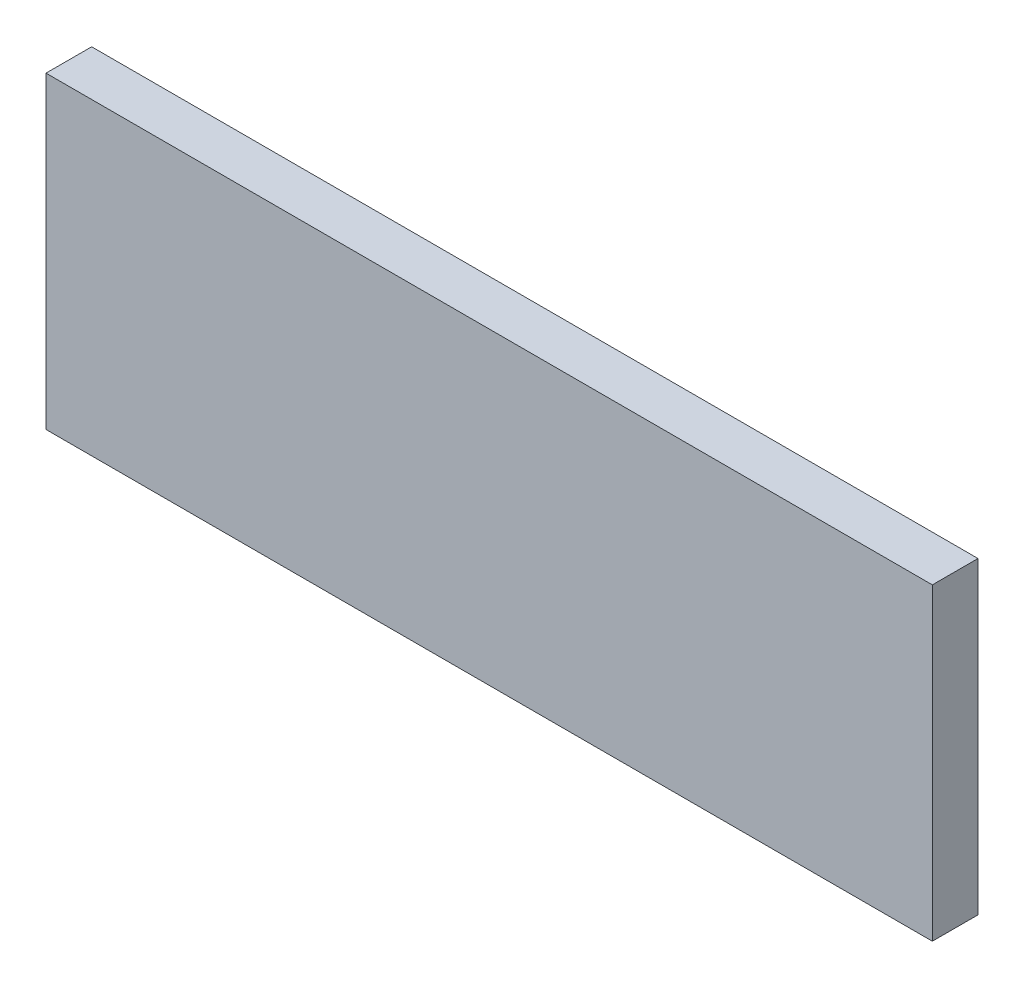
ISO-10303-21;
HEADER;
FILE_DESCRIPTION(('STEP AP214'),'2;1');
FILE_NAME('part.step','',(''),(''),'','','');
FILE_SCHEMA(('AUTOMOTIVE_DESIGN { 1 0 10303 214 1 1 1 1 }'));
ENDSEC;
DATA;
#1=APPLICATION_CONTEXT('core data for automotive mechanical design processes');
#2=APPLICATION_PROTOCOL_DEFINITION('international standard','automotive_design',2000,#1);
#3=PRODUCT_CONTEXT('',#1,'mechanical');
#4=PRODUCT('Part','Part','',(#3));
#5=PRODUCT_RELATED_PRODUCT_CATEGORY('part','',(#4));
#6=PRODUCT_DEFINITION_FORMATION('','',#4);
#7=PRODUCT_DEFINITION_CONTEXT('part definition',#1,'design');
#8=PRODUCT_DEFINITION('design','',#6,#7);
#9=PRODUCT_DEFINITION_SHAPE('','',#8);
#10=(LENGTH_UNIT() NAMED_UNIT(*) SI_UNIT(.MILLI.,.METRE.));
#11=(NAMED_UNIT(*) PLANE_ANGLE_UNIT() SI_UNIT($,.RADIAN.));
#12=(NAMED_UNIT(*) SI_UNIT($,.STERADIAN.) SOLID_ANGLE_UNIT());
#13=UNCERTAINTY_MEASURE_WITH_UNIT(LENGTH_MEASURE(1.E-05),#10,'distance_accuracy_value','');
#14=(GEOMETRIC_REPRESENTATION_CONTEXT(3) GLOBAL_UNCERTAINTY_ASSIGNED_CONTEXT((#13)) GLOBAL_UNIT_ASSIGNED_CONTEXT((#10,
#11,#12)) REPRESENTATION_CONTEXT('',''));
#15=CARTESIAN_POINT('',(0.,0.,0.));
#16=DIRECTION('',(0.,0.,1.));
#17=DIRECTION('',(1.,0.,0.));
#18=AXIS2_PLACEMENT_3D('',#15,#16,#17);
#19=CARTESIAN_POINT('',(46.228,-16.09725,4.7625));
#20=DIRECTION('',(-1.,0.,0.));
#21=DIRECTION('',(0.,0.,1.));
#22=AXIS2_PLACEMENT_3D('',#19,#20,#21);
#23=PLANE('',#22);
#24=DIRECTION('',(0.,1.,0.));
#25=VECTOR('',#24,1.);
#26=CARTESIAN_POINT('',(46.228,-16.09725,0.));
#27=LINE('',#26,#25);
#28=CARTESIAN_POINT('',(46.228,-16.09725,0.));
#29=VERTEX_POINT('',#28);
#30=CARTESIAN_POINT('',(46.228,16.09725,0.));
#31=VERTEX_POINT('',#30);
#32=EDGE_CURVE('E96',#29,#31,#27,.T.);
#33=ORIENTED_EDGE('',*,*,#32,.T.);
#34=DIRECTION('',(0.,0.,-1.));
#35=VECTOR('',#34,1.);
#36=CARTESIAN_POINT('',(46.228,16.09725,4.7625));
#37=LINE('',#36,#35);
#38=CARTESIAN_POINT('',(46.228,16.09725,4.7625));
#39=VERTEX_POINT('',#38);
#40=EDGE_CURVE('E11',#39,#31,#37,.T.);
#41=ORIENTED_EDGE('',*,*,#40,.F.);
#42=DIRECTION('',(0.,1.,0.));
#43=VECTOR('',#42,1.);
#44=CARTESIAN_POINT('',(46.228,-16.09725,4.7625));
#45=LINE('',#44,#43);
#46=CARTESIAN_POINT('',(46.228,-16.09725,4.7625));
#47=VERTEX_POINT('',#46);
#48=EDGE_CURVE('E84',#47,#39,#45,.T.);
#49=ORIENTED_EDGE('',*,*,#48,.F.);
#50=DIRECTION('',(0.,0.,-1.));
#51=VECTOR('',#50,1.);
#52=CARTESIAN_POINT('',(46.228,-16.09725,4.7625));
#53=LINE('',#52,#51);
#54=EDGE_CURVE('E92',#47,#29,#53,.T.);
#55=ORIENTED_EDGE('',*,*,#54,.T.);
#56=EDGE_LOOP('',(#33,#41,#49,#55));
#57=FACE_BOUND('',#56,.T.);
#58=ADVANCED_FACE('F33',(#57),#23,.F.);
#59=CARTESIAN_POINT('',(-46.228,16.09725,4.7625));
#60=DIRECTION('',(0.,-1.,0.));
#61=DIRECTION('',(0.,0.,-1.));
#62=AXIS2_PLACEMENT_3D('',#59,#60,#61);
#63=PLANE('',#62);
#64=DIRECTION('',(-1.,0.,0.));
#65=VECTOR('',#64,1.);
#66=CARTESIAN_POINT('',(-46.228,16.09725,0.));
#67=LINE('',#66,#65);
#68=CARTESIAN_POINT('',(-46.228,16.09725,0.));
#69=VERTEX_POINT('',#68);
#70=EDGE_CURVE('E88',#31,#69,#67,.T.);
#71=ORIENTED_EDGE('',*,*,#70,.T.);
#72=DIRECTION('',(0.,0.,-1.));
#73=VECTOR('',#72,1.);
#74=CARTESIAN_POINT('',(-46.228,16.09725,4.7625));
#75=LINE('',#74,#73);
#76=CARTESIAN_POINT('',(-46.228,16.09725,4.7625));
#77=VERTEX_POINT('',#76);
#78=EDGE_CURVE('E41',#77,#69,#75,.T.);
#79=ORIENTED_EDGE('',*,*,#78,.F.);
#80=DIRECTION('',(-1.,0.,0.));
#81=VECTOR('',#80,1.);
#82=CARTESIAN_POINT('',(-46.228,16.09725,4.7625));
#83=LINE('',#82,#81);
#84=EDGE_CURVE('E79',#39,#77,#83,.T.);
#85=ORIENTED_EDGE('',*,*,#84,.F.);
#86=ORIENTED_EDGE('',*,*,#40,.T.);
#87=EDGE_LOOP('',(#71,#79,#85,#86));
#88=FACE_BOUND('',#87,.T.);
#89=ADVANCED_FACE('F87',(#88),#63,.F.);
#90=CARTESIAN_POINT('',(-46.228,-16.09725,4.7625));
#91=DIRECTION('',(1.,0.,0.));
#92=DIRECTION('',(0.,0.,-1.));
#93=AXIS2_PLACEMENT_3D('',#90,#91,#92);
#94=PLANE('',#93);
#95=DIRECTION('',(0.,-1.,0.));
#96=VECTOR('',#95,1.);
#97=CARTESIAN_POINT('',(-46.228,-16.09725,0.));
#98=LINE('',#97,#96);
#99=CARTESIAN_POINT('',(-46.228,-16.09725,0.));
#100=VERTEX_POINT('',#99);
#101=EDGE_CURVE('E66',#69,#100,#98,.T.);
#102=ORIENTED_EDGE('',*,*,#101,.T.);
#103=DIRECTION('',(0.,0.,-1.));
#104=VECTOR('',#103,1.);
#105=CARTESIAN_POINT('',(-46.228,-16.09725,4.7625));
#106=LINE('',#105,#104);
#107=CARTESIAN_POINT('',(-46.228,-16.09725,4.7625));
#108=VERTEX_POINT('',#107);
#109=EDGE_CURVE('E89',#108,#100,#106,.T.);
#110=ORIENTED_EDGE('',*,*,#109,.F.);
#111=DIRECTION('',(0.,-1.,0.));
#112=VECTOR('',#111,1.);
#113=CARTESIAN_POINT('',(-46.228,-16.09725,4.7625));
#114=LINE('',#113,#112);
#115=EDGE_CURVE('E82',#77,#108,#114,.T.);
#116=ORIENTED_EDGE('',*,*,#115,.F.);
#117=ORIENTED_EDGE('',*,*,#78,.T.);
#118=EDGE_LOOP('',(#102,#110,#116,#117));
#119=FACE_BOUND('',#118,.T.);
#120=ADVANCED_FACE('F90',(#119),#94,.F.);
#121=CARTESIAN_POINT('',(-46.228,-16.09725,4.7625));
#122=DIRECTION('',(0.,1.,0.));
#123=DIRECTION('',(0.,0.,1.));
#124=AXIS2_PLACEMENT_3D('',#121,#122,#123);
#125=PLANE('',#124);
#126=DIRECTION('',(1.,0.,0.));
#127=VECTOR('',#126,1.);
#128=CARTESIAN_POINT('',(-46.228,-16.09725,0.));
#129=LINE('',#128,#127);
#130=EDGE_CURVE('E72',#100,#29,#129,.T.);
#131=ORIENTED_EDGE('',*,*,#130,.T.);
#132=ORIENTED_EDGE('',*,*,#54,.F.);
#133=DIRECTION('',(1.,0.,0.));
#134=VECTOR('',#133,1.);
#135=CARTESIAN_POINT('',(-46.228,-16.09725,4.7625));
#136=LINE('',#135,#134);
#137=EDGE_CURVE('E49',#108,#47,#136,.T.);
#138=ORIENTED_EDGE('',*,*,#137,.F.);
#139=ORIENTED_EDGE('',*,*,#109,.T.);
#140=EDGE_LOOP('',(#131,#132,#138,#139));
#141=FACE_BOUND('',#140,.T.);
#142=ADVANCED_FACE('F103',(#141),#125,.F.);
#143=CARTESIAN_POINT('',(46.228,16.09725,4.7625));
#144=DIRECTION('',(0.,0.,-1.));
#145=DIRECTION('',(-1.,0.,0.));
#146=AXIS2_PLACEMENT_3D('',#143,#144,#145);
#147=PLANE('',#146);
#148=ORIENTED_EDGE('',*,*,#48,.T.);
#149=ORIENTED_EDGE('',*,*,#84,.T.);
#150=ORIENTED_EDGE('',*,*,#115,.T.);
#151=ORIENTED_EDGE('',*,*,#137,.T.);
#152=EDGE_LOOP('',(#148,#149,#150,#151));
#153=FACE_BOUND('',#152,.T.);
#154=ADVANCED_FACE('F80',(#153),#147,.F.);
#155=CARTESIAN_POINT('',(46.228,16.09725,0.));
#156=DIRECTION('',(0.,0.,-1.));
#157=DIRECTION('',(-1.,0.,0.));
#158=AXIS2_PLACEMENT_3D('',#155,#156,#157);
#159=PLANE('',#158);
#160=ORIENTED_EDGE('',*,*,#32,.F.);
#161=ORIENTED_EDGE('',*,*,#130,.F.);
#162=ORIENTED_EDGE('',*,*,#101,.F.);
#163=ORIENTED_EDGE('',*,*,#70,.F.);
#164=EDGE_LOOP('',(#160,#161,#162,#163));
#165=FACE_BOUND('',#164,.T.);
#166=ADVANCED_FACE('F106',(#165),#159,.T.);
#167=CLOSED_SHELL('',(#58,#89,#120,#142,#154,#166));
#168=MANIFOLD_SOLID_BREP('B2',#167);
#169=ADVANCED_BREP_SHAPE_REPRESENTATION('',(#18,#168),#14);
#170=SHAPE_DEFINITION_REPRESENTATION(#9,#169);
ENDSEC;
END-ISO-10303-21;
